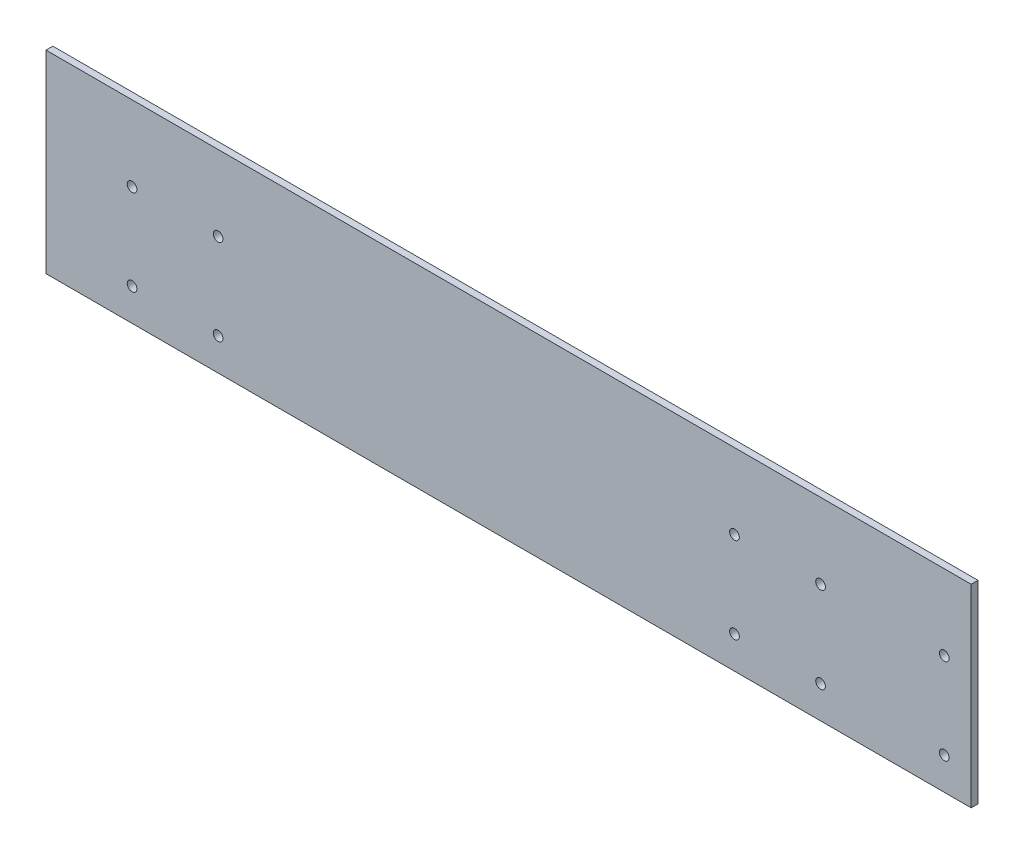
ISO-10303-21;
HEADER;
FILE_DESCRIPTION(('STEP AP214'),'2;1');
FILE_NAME('part.step','',(''),(''),'','','');
FILE_SCHEMA(('AUTOMOTIVE_DESIGN { 1 0 10303 214 1 1 1 1 }'));
ENDSEC;
DATA;
#1=APPLICATION_CONTEXT('core data for automotive mechanical design processes');
#2=APPLICATION_PROTOCOL_DEFINITION('international standard','automotive_design',2000,#1);
#3=PRODUCT_CONTEXT('',#1,'mechanical');
#4=PRODUCT('Part','Part','',(#3));
#5=PRODUCT_RELATED_PRODUCT_CATEGORY('part','',(#4));
#6=PRODUCT_DEFINITION_FORMATION('','',#4);
#7=PRODUCT_DEFINITION_CONTEXT('part definition',#1,'design');
#8=PRODUCT_DEFINITION('design','',#6,#7);
#9=PRODUCT_DEFINITION_SHAPE('','',#8);
#10=(LENGTH_UNIT() NAMED_UNIT(*) SI_UNIT(.MILLI.,.METRE.));
#11=(NAMED_UNIT(*) PLANE_ANGLE_UNIT() SI_UNIT($,.RADIAN.));
#12=(NAMED_UNIT(*) SI_UNIT($,.STERADIAN.) SOLID_ANGLE_UNIT());
#13=UNCERTAINTY_MEASURE_WITH_UNIT(LENGTH_MEASURE(1.E-05),#10,'distance_accuracy_value','');
#14=(GEOMETRIC_REPRESENTATION_CONTEXT(3) GLOBAL_UNCERTAINTY_ASSIGNED_CONTEXT((#13)) GLOBAL_UNIT_ASSIGNED_CONTEXT((#10,
#11,#12)) REPRESENTATION_CONTEXT('',''));
#15=CARTESIAN_POINT('',(0.,0.,0.));
#16=DIRECTION('',(0.,0.,1.));
#17=DIRECTION('',(1.,0.,0.));
#18=AXIS2_PLACEMENT_3D('',#15,#16,#17);
#19=CARTESIAN_POINT('',(0.,0.,0.));
#20=DIRECTION('',(0.,0.,-1.));
#21=DIRECTION('',(-1.,0.,0.));
#22=AXIS2_PLACEMENT_3D('',#19,#20,#21);
#23=PLANE('',#22);
#24=CARTESIAN_POINT('',(-135.,9.99999999999998,0.));
#25=DIRECTION('',(0.,0.,1.));
#26=DIRECTION('',(1.,0.,0.));
#27=AXIS2_PLACEMENT_3D('',#24,#25,#26);
#28=CIRCLE('',#27,2.25);
#29=CARTESIAN_POINT('',(-132.75,9.99999999999998,0.));
#30=VERTEX_POINT('',#29);
#31=EDGE_CURVE('E201',#30,#30,#28,.T.);
#32=ORIENTED_EDGE('',*,*,#31,.T.);
#33=EDGE_LOOP('',(#32));
#34=FACE_BOUND('',#33,.T.);
#35=CARTESIAN_POINT('',(-175.,9.99999999999999,0.));
#36=DIRECTION('',(0.,0.,1.));
#37=DIRECTION('',(1.,0.,0.));
#38=AXIS2_PLACEMENT_3D('',#35,#36,#37);
#39=CIRCLE('',#38,2.25);
#40=CARTESIAN_POINT('',(-172.75,9.99999999999999,0.));
#41=VERTEX_POINT('',#40);
#42=EDGE_CURVE('E185',#41,#41,#39,.T.);
#43=ORIENTED_EDGE('',*,*,#42,.T.);
#44=EDGE_LOOP('',(#43));
#45=FACE_BOUND('',#44,.T.);
#46=CARTESIAN_POINT('',(-135.,-30.,0.));
#47=DIRECTION('',(0.,0.,1.));
#48=DIRECTION('',(1.,0.,0.));
#49=AXIS2_PLACEMENT_3D('',#46,#47,#48);
#50=CIRCLE('',#49,2.25);
#51=CARTESIAN_POINT('',(-132.75,-30.,0.));
#52=VERTEX_POINT('',#51);
#53=EDGE_CURVE('E177',#52,#52,#50,.T.);
#54=ORIENTED_EDGE('',*,*,#53,.T.);
#55=EDGE_LOOP('',(#54));
#56=FACE_BOUND('',#55,.T.);
#57=CARTESIAN_POINT('',(145.,9.99999999999999,0.));
#58=DIRECTION('',(0.,0.,1.));
#59=DIRECTION('',(1.,0.,0.));
#60=AXIS2_PLACEMENT_3D('',#57,#58,#59);
#61=CIRCLE('',#60,2.25);
#62=CARTESIAN_POINT('',(147.25,9.99999999999999,0.));
#63=VERTEX_POINT('',#62);
#64=EDGE_CURVE('E169',#63,#63,#61,.T.);
#65=ORIENTED_EDGE('',*,*,#64,.T.);
#66=EDGE_LOOP('',(#65));
#67=FACE_BOUND('',#66,.T.);
#68=CARTESIAN_POINT('',(105.,-30.,0.));
#69=DIRECTION('',(0.,0.,1.));
#70=DIRECTION('',(1.,0.,0.));
#71=AXIS2_PLACEMENT_3D('',#68,#69,#70);
#72=CIRCLE('',#71,2.25);
#73=CARTESIAN_POINT('',(107.25,-30.,0.));
#74=VERTEX_POINT('',#73);
#75=EDGE_CURVE('E161',#74,#74,#72,.T.);
#76=ORIENTED_EDGE('',*,*,#75,.T.);
#77=EDGE_LOOP('',(#76));
#78=FACE_BOUND('',#77,.T.);
#79=CARTESIAN_POINT('',(105.,9.99999999999999,0.));
#80=DIRECTION('',(0.,0.,1.));
#81=DIRECTION('',(1.,0.,0.));
#82=AXIS2_PLACEMENT_3D('',#79,#80,#81);
#83=CIRCLE('',#82,2.25);
#84=CARTESIAN_POINT('',(107.25,9.99999999999999,0.));
#85=VERTEX_POINT('',#84);
#86=EDGE_CURVE('E153',#85,#85,#83,.T.);
#87=ORIENTED_EDGE('',*,*,#86,.T.);
#88=EDGE_LOOP('',(#87));
#89=FACE_BOUND('',#88,.T.);
#90=CARTESIAN_POINT('',(145.,-30.,0.));
#91=DIRECTION('',(0.,0.,1.));
#92=DIRECTION('',(1.,0.,0.));
#93=AXIS2_PLACEMENT_3D('',#90,#91,#92);
#94=CIRCLE('',#93,2.25);
#95=CARTESIAN_POINT('',(147.25,-30.,0.));
#96=VERTEX_POINT('',#95);
#97=EDGE_CURVE('E145',#96,#96,#94,.T.);
#98=ORIENTED_EDGE('',*,*,#97,.T.);
#99=EDGE_LOOP('',(#98));
#100=FACE_BOUND('',#99,.T.);
#101=CARTESIAN_POINT('',(202.5,9.99999999999999,0.));
#102=DIRECTION('',(0.,0.,1.));
#103=DIRECTION('',(1.,0.,0.));
#104=AXIS2_PLACEMENT_3D('',#101,#102,#103);
#105=CIRCLE('',#104,2.25);
#106=CARTESIAN_POINT('',(204.75,9.99999999999999,0.));
#107=VERTEX_POINT('',#106);
#108=EDGE_CURVE('E137',#107,#107,#105,.T.);
#109=ORIENTED_EDGE('',*,*,#108,.T.);
#110=EDGE_LOOP('',(#109));
#111=FACE_BOUND('',#110,.T.);
#112=CARTESIAN_POINT('',(202.5,-30.,0.));
#113=DIRECTION('',(0.,0.,1.));
#114=DIRECTION('',(1.,0.,0.));
#115=AXIS2_PLACEMENT_3D('',#112,#113,#114);
#116=CIRCLE('',#115,2.25);
#117=CARTESIAN_POINT('',(204.75,-30.,0.));
#118=VERTEX_POINT('',#117);
#119=EDGE_CURVE('E113',#118,#118,#116,.T.);
#120=ORIENTED_EDGE('',*,*,#119,.T.);
#121=EDGE_LOOP('',(#120));
#122=FACE_BOUND('',#121,.T.);
#123=DIRECTION('',(0.,1.,0.));
#124=VECTOR('',#123,1.);
#125=CARTESIAN_POINT('',(215.,-45.,0.));
#126=LINE('',#125,#124);
#127=CARTESIAN_POINT('',(215.,-45.,0.));
#128=VERTEX_POINT('',#127);
#129=CARTESIAN_POINT('',(215.,45.,0.));
#130=VERTEX_POINT('',#129);
#131=EDGE_CURVE('E109',#128,#130,#126,.T.);
#132=ORIENTED_EDGE('',*,*,#131,.F.);
#133=DIRECTION('',(1.,0.,0.));
#134=VECTOR('',#133,1.);
#135=CARTESIAN_POINT('',(-215.,-45.,0.));
#136=LINE('',#135,#134);
#137=CARTESIAN_POINT('',(-215.,-45.,0.));
#138=VERTEX_POINT('',#137);
#139=EDGE_CURVE('E80',#138,#128,#136,.T.);
#140=ORIENTED_EDGE('',*,*,#139,.F.);
#141=DIRECTION('',(0.,-1.,0.));
#142=VECTOR('',#141,1.);
#143=CARTESIAN_POINT('',(-215.,-45.,0.));
#144=LINE('',#143,#142);
#145=CARTESIAN_POINT('',(-215.,45.,0.));
#146=VERTEX_POINT('',#145);
#147=EDGE_CURVE('E74',#146,#138,#144,.T.);
#148=ORIENTED_EDGE('',*,*,#147,.F.);
#149=DIRECTION('',(-1.,0.,0.));
#150=VECTOR('',#149,1.);
#151=CARTESIAN_POINT('',(-215.,45.,0.));
#152=LINE('',#151,#150);
#153=EDGE_CURVE('E98',#130,#146,#152,.T.);
#154=ORIENTED_EDGE('',*,*,#153,.F.);
#155=EDGE_LOOP('',(#132,#140,#148,#154));
#156=FACE_BOUND('',#155,.T.);
#157=CARTESIAN_POINT('',(-175.,-30.,0.));
#158=DIRECTION('',(0.,0.,1.));
#159=DIRECTION('',(1.,0.,0.));
#160=AXIS2_PLACEMENT_3D('',#157,#158,#159);
#161=CIRCLE('',#160,2.25);
#162=CARTESIAN_POINT('',(-172.75,-30.,0.));
#163=VERTEX_POINT('',#162);
#164=EDGE_CURVE('E193',#163,#163,#161,.T.);
#165=ORIENTED_EDGE('',*,*,#164,.T.);
#166=EDGE_LOOP('',(#165));
#167=FACE_BOUND('',#166,.T.);
#168=ADVANCED_FACE('F39',(#34,#45,#56,#67,#78,#89,#100,#111,#122,#156,#167),#23,.T.);
#169=CARTESIAN_POINT('',(0.,0.,3.175));
#170=DIRECTION('',(0.,0.,-1.));
#171=DIRECTION('',(-1.,0.,0.));
#172=AXIS2_PLACEMENT_3D('',#169,#170,#171);
#173=PLANE('',#172);
#174=CARTESIAN_POINT('',(-135.,9.99999999999998,3.175));
#175=DIRECTION('',(0.,0.,1.));
#176=DIRECTION('',(1.,0.,0.));
#177=AXIS2_PLACEMENT_3D('',#174,#175,#176);
#178=CIRCLE('',#177,2.24999999999997);
#179=CARTESIAN_POINT('',(-132.75,9.99999999999998,3.175));
#180=VERTEX_POINT('',#179);
#181=EDGE_CURVE('E205',#180,#180,#178,.T.);
#182=ORIENTED_EDGE('',*,*,#181,.F.);
#183=EDGE_LOOP('',(#182));
#184=FACE_BOUND('',#183,.T.);
#185=CARTESIAN_POINT('',(-175.,-30.,3.175));
#186=DIRECTION('',(0.,0.,1.));
#187=DIRECTION('',(1.,0.,0.));
#188=AXIS2_PLACEMENT_3D('',#185,#186,#187);
#189=CIRCLE('',#188,2.24999999999997);
#190=CARTESIAN_POINT('',(-172.75,-30.,3.175));
#191=VERTEX_POINT('',#190);
#192=EDGE_CURVE('E197',#191,#191,#189,.T.);
#193=ORIENTED_EDGE('',*,*,#192,.F.);
#194=EDGE_LOOP('',(#193));
#195=FACE_BOUND('',#194,.T.);
#196=CARTESIAN_POINT('',(-175.,9.99999999999999,3.175));
#197=DIRECTION('',(0.,0.,1.));
#198=DIRECTION('',(1.,0.,0.));
#199=AXIS2_PLACEMENT_3D('',#196,#197,#198);
#200=CIRCLE('',#199,2.24999999999997);
#201=CARTESIAN_POINT('',(-172.75,9.99999999999999,3.175));
#202=VERTEX_POINT('',#201);
#203=EDGE_CURVE('E189',#202,#202,#200,.T.);
#204=ORIENTED_EDGE('',*,*,#203,.F.);
#205=EDGE_LOOP('',(#204));
#206=FACE_BOUND('',#205,.T.);
#207=CARTESIAN_POINT('',(-135.,-30.,3.175));
#208=DIRECTION('',(0.,0.,1.));
#209=DIRECTION('',(1.,0.,0.));
#210=AXIS2_PLACEMENT_3D('',#207,#208,#209);
#211=CIRCLE('',#210,2.24999999999997);
#212=CARTESIAN_POINT('',(-132.75,-30.,3.175));
#213=VERTEX_POINT('',#212);
#214=EDGE_CURVE('E181',#213,#213,#211,.T.);
#215=ORIENTED_EDGE('',*,*,#214,.F.);
#216=EDGE_LOOP('',(#215));
#217=FACE_BOUND('',#216,.T.);
#218=CARTESIAN_POINT('',(145.,9.99999999999999,3.175));
#219=DIRECTION('',(0.,0.,1.));
#220=DIRECTION('',(1.,0.,0.));
#221=AXIS2_PLACEMENT_3D('',#218,#219,#220);
#222=CIRCLE('',#221,2.25);
#223=CARTESIAN_POINT('',(147.25,9.99999999999999,3.175));
#224=VERTEX_POINT('',#223);
#225=EDGE_CURVE('E173',#224,#224,#222,.T.);
#226=ORIENTED_EDGE('',*,*,#225,.F.);
#227=EDGE_LOOP('',(#226));
#228=FACE_BOUND('',#227,.T.);
#229=CARTESIAN_POINT('',(105.,-30.,3.175));
#230=DIRECTION('',(0.,0.,1.));
#231=DIRECTION('',(1.,0.,0.));
#232=AXIS2_PLACEMENT_3D('',#229,#230,#231);
#233=CIRCLE('',#232,2.24999999999999);
#234=CARTESIAN_POINT('',(107.25,-30.,3.175));
#235=VERTEX_POINT('',#234);
#236=EDGE_CURVE('E165',#235,#235,#233,.T.);
#237=ORIENTED_EDGE('',*,*,#236,.F.);
#238=EDGE_LOOP('',(#237));
#239=FACE_BOUND('',#238,.T.);
#240=CARTESIAN_POINT('',(105.,9.99999999999999,3.175));
#241=DIRECTION('',(0.,0.,1.));
#242=DIRECTION('',(1.,0.,0.));
#243=AXIS2_PLACEMENT_3D('',#240,#241,#242);
#244=CIRCLE('',#243,2.24999999999999);
#245=CARTESIAN_POINT('',(107.25,9.99999999999999,3.175));
#246=VERTEX_POINT('',#245);
#247=EDGE_CURVE('E157',#246,#246,#244,.T.);
#248=ORIENTED_EDGE('',*,*,#247,.F.);
#249=EDGE_LOOP('',(#248));
#250=FACE_BOUND('',#249,.T.);
#251=CARTESIAN_POINT('',(145.,-30.,3.175));
#252=DIRECTION('',(0.,0.,1.));
#253=DIRECTION('',(1.,0.,0.));
#254=AXIS2_PLACEMENT_3D('',#251,#252,#253);
#255=CIRCLE('',#254,2.25);
#256=CARTESIAN_POINT('',(147.25,-30.,3.175));
#257=VERTEX_POINT('',#256);
#258=EDGE_CURVE('E149',#257,#257,#255,.T.);
#259=ORIENTED_EDGE('',*,*,#258,.F.);
#260=EDGE_LOOP('',(#259));
#261=FACE_BOUND('',#260,.T.);
#262=CARTESIAN_POINT('',(202.5,-30.,3.175));
#263=DIRECTION('',(0.,0.,1.));
#264=DIRECTION('',(1.,0.,0.));
#265=AXIS2_PLACEMENT_3D('',#262,#263,#264);
#266=CIRCLE('',#265,2.25);
#267=CARTESIAN_POINT('',(204.75,-30.,3.175));
#268=VERTEX_POINT('',#267);
#269=EDGE_CURVE('E133',#268,#268,#266,.T.);
#270=ORIENTED_EDGE('',*,*,#269,.F.);
#271=EDGE_LOOP('',(#270));
#272=FACE_BOUND('',#271,.T.);
#273=DIRECTION('',(0.,1.,0.));
#274=VECTOR('',#273,1.);
#275=CARTESIAN_POINT('',(215.,-45.,3.175));
#276=LINE('',#275,#274);
#277=CARTESIAN_POINT('',(215.,-45.,3.175));
#278=VERTEX_POINT('',#277);
#279=CARTESIAN_POINT('',(215.,45.,3.175));
#280=VERTEX_POINT('',#279);
#281=EDGE_CURVE('E93',#278,#280,#276,.T.);
#282=ORIENTED_EDGE('',*,*,#281,.T.);
#283=DIRECTION('',(-1.,0.,0.));
#284=VECTOR('',#283,1.);
#285=CARTESIAN_POINT('',(-215.,45.,3.175));
#286=LINE('',#285,#284);
#287=CARTESIAN_POINT('',(-215.,45.,3.175));
#288=VERTEX_POINT('',#287);
#289=EDGE_CURVE('E87',#280,#288,#286,.T.);
#290=ORIENTED_EDGE('',*,*,#289,.T.);
#291=DIRECTION('',(0.,-1.,0.));
#292=VECTOR('',#291,1.);
#293=CARTESIAN_POINT('',(-215.,-45.,3.175));
#294=LINE('',#293,#292);
#295=CARTESIAN_POINT('',(-215.,-45.,3.175));
#296=VERTEX_POINT('',#295);
#297=EDGE_CURVE('E91',#288,#296,#294,.T.);
#298=ORIENTED_EDGE('',*,*,#297,.T.);
#299=DIRECTION('',(1.,0.,0.));
#300=VECTOR('',#299,1.);
#301=CARTESIAN_POINT('',(-215.,-45.,3.175));
#302=LINE('',#301,#300);
#303=EDGE_CURVE('E57',#296,#278,#302,.T.);
#304=ORIENTED_EDGE('',*,*,#303,.T.);
#305=EDGE_LOOP('',(#282,#290,#298,#304));
#306=FACE_BOUND('',#305,.T.);
#307=CARTESIAN_POINT('',(202.5,9.99999999999999,3.175));
#308=DIRECTION('',(0.,0.,1.));
#309=DIRECTION('',(1.,0.,0.));
#310=AXIS2_PLACEMENT_3D('',#307,#308,#309);
#311=CIRCLE('',#310,2.25);
#312=CARTESIAN_POINT('',(204.75,9.99999999999999,3.175));
#313=VERTEX_POINT('',#312);
#314=EDGE_CURVE('E141',#313,#313,#311,.T.);
#315=ORIENTED_EDGE('',*,*,#314,.F.);
#316=EDGE_LOOP('',(#315));
#317=FACE_BOUND('',#316,.T.);
#318=ADVANCED_FACE('F88',(#184,#195,#206,#217,#228,#239,#250,#261,#272,#306,#317),#173,.F.);
#319=CARTESIAN_POINT('',(215.,-45.,3.175));
#320=DIRECTION('',(-1.,0.,0.));
#321=DIRECTION('',(0.,0.,1.));
#322=AXIS2_PLACEMENT_3D('',#319,#320,#321);
#323=PLANE('',#322);
#324=ORIENTED_EDGE('',*,*,#131,.T.);
#325=DIRECTION('',(0.,0.,-1.));
#326=VECTOR('',#325,1.);
#327=CARTESIAN_POINT('',(215.,45.,3.175));
#328=LINE('',#327,#326);
#329=EDGE_CURVE('E11',#280,#130,#328,.T.);
#330=ORIENTED_EDGE('',*,*,#329,.F.);
#331=ORIENTED_EDGE('',*,*,#281,.F.);
#332=DIRECTION('',(0.,0.,-1.));
#333=VECTOR('',#332,1.);
#334=CARTESIAN_POINT('',(215.,-45.,3.175));
#335=LINE('',#334,#333);
#336=EDGE_CURVE('E105',#278,#128,#335,.T.);
#337=ORIENTED_EDGE('',*,*,#336,.T.);
#338=EDGE_LOOP('',(#324,#330,#331,#337));
#339=FACE_BOUND('',#338,.T.);
#340=ADVANCED_FACE('F41',(#339),#323,.F.);
#341=CARTESIAN_POINT('',(-215.,45.,3.175));
#342=DIRECTION('',(0.,-1.,0.));
#343=DIRECTION('',(0.,0.,-1.));
#344=AXIS2_PLACEMENT_3D('',#341,#342,#343);
#345=PLANE('',#344);
#346=ORIENTED_EDGE('',*,*,#153,.T.);
#347=DIRECTION('',(0.,0.,-1.));
#348=VECTOR('',#347,1.);
#349=CARTESIAN_POINT('',(-215.,45.,3.175));
#350=LINE('',#349,#348);
#351=EDGE_CURVE('E49',#288,#146,#350,.T.);
#352=ORIENTED_EDGE('',*,*,#351,.F.);
#353=ORIENTED_EDGE('',*,*,#289,.F.);
#354=ORIENTED_EDGE('',*,*,#329,.T.);
#355=EDGE_LOOP('',(#346,#352,#353,#354));
#356=FACE_BOUND('',#355,.T.);
#357=ADVANCED_FACE('F97',(#356),#345,.F.);
#358=CARTESIAN_POINT('',(-215.,-45.,3.175));
#359=DIRECTION('',(1.,0.,0.));
#360=DIRECTION('',(0.,0.,-1.));
#361=AXIS2_PLACEMENT_3D('',#358,#359,#360);
#362=PLANE('',#361);
#363=ORIENTED_EDGE('',*,*,#147,.T.);
#364=DIRECTION('',(0.,0.,-1.));
#365=VECTOR('',#364,1.);
#366=CARTESIAN_POINT('',(-215.,-45.,3.175));
#367=LINE('',#366,#365);
#368=EDGE_CURVE('E100',#296,#138,#367,.T.);
#369=ORIENTED_EDGE('',*,*,#368,.F.);
#370=ORIENTED_EDGE('',*,*,#297,.F.);
#371=ORIENTED_EDGE('',*,*,#351,.T.);
#372=EDGE_LOOP('',(#363,#369,#370,#371));
#373=FACE_BOUND('',#372,.T.);
#374=ADVANCED_FACE('F101',(#373),#362,.F.);
#375=CARTESIAN_POINT('',(-215.,-45.,3.175));
#376=DIRECTION('',(0.,1.,0.));
#377=DIRECTION('',(0.,0.,1.));
#378=AXIS2_PLACEMENT_3D('',#375,#376,#377);
#379=PLANE('',#378);
#380=ORIENTED_EDGE('',*,*,#139,.T.);
#381=ORIENTED_EDGE('',*,*,#336,.F.);
#382=ORIENTED_EDGE('',*,*,#303,.F.);
#383=ORIENTED_EDGE('',*,*,#368,.T.);
#384=EDGE_LOOP('',(#380,#381,#382,#383));
#385=FACE_BOUND('',#384,.T.);
#386=ADVANCED_FACE('F123',(#385),#379,.F.);
#387=CARTESIAN_POINT('',(202.5,-30.,3.175));
#388=DIRECTION('',(0.,0.,1.));
#389=DIRECTION('',(1.,0.,0.));
#390=AXIS2_PLACEMENT_3D('',#387,#388,#389);
#391=CYLINDRICAL_SURFACE('',#390,2.25);
#392=ORIENTED_EDGE('',*,*,#119,.F.);
#393=EDGE_LOOP('',(#392));
#394=FACE_BOUND('',#393,.T.);
#395=ORIENTED_EDGE('',*,*,#269,.T.);
#396=EDGE_LOOP('',(#395));
#397=FACE_BOUND('',#396,.T.);
#398=ADVANCED_FACE('F231',(#394,#397),#391,.F.);
#399=CARTESIAN_POINT('',(202.5,9.99999999999999,3.175));
#400=DIRECTION('',(0.,0.,1.));
#401=DIRECTION('',(1.,0.,0.));
#402=AXIS2_PLACEMENT_3D('',#399,#400,#401);
#403=CYLINDRICAL_SURFACE('',#402,2.25);
#404=ORIENTED_EDGE('',*,*,#108,.F.);
#405=EDGE_LOOP('',(#404));
#406=FACE_BOUND('',#405,.T.);
#407=ORIENTED_EDGE('',*,*,#314,.T.);
#408=EDGE_LOOP('',(#407));
#409=FACE_BOUND('',#408,.T.);
#410=ADVANCED_FACE('F233',(#406,#409),#403,.F.);
#411=CARTESIAN_POINT('',(145.,-30.,3.175));
#412=DIRECTION('',(0.,0.,1.));
#413=DIRECTION('',(1.,0.,0.));
#414=AXIS2_PLACEMENT_3D('',#411,#412,#413);
#415=CYLINDRICAL_SURFACE('',#414,2.25);
#416=ORIENTED_EDGE('',*,*,#97,.F.);
#417=EDGE_LOOP('',(#416));
#418=FACE_BOUND('',#417,.T.);
#419=ORIENTED_EDGE('',*,*,#258,.T.);
#420=EDGE_LOOP('',(#419));
#421=FACE_BOUND('',#420,.T.);
#422=ADVANCED_FACE('F240',(#418,#421),#415,.F.);
#423=CARTESIAN_POINT('',(105.,9.99999999999999,3.175));
#424=DIRECTION('',(0.,0.,1.));
#425=DIRECTION('',(1.,0.,0.));
#426=AXIS2_PLACEMENT_3D('',#423,#424,#425);
#427=CYLINDRICAL_SURFACE('',#426,2.25);
#428=ORIENTED_EDGE('',*,*,#86,.F.);
#429=EDGE_LOOP('',(#428));
#430=FACE_BOUND('',#429,.T.);
#431=ORIENTED_EDGE('',*,*,#247,.T.);
#432=EDGE_LOOP('',(#431));
#433=FACE_BOUND('',#432,.T.);
#434=ADVANCED_FACE('F286',(#430,#433),#427,.F.);
#435=CARTESIAN_POINT('',(105.,-30.,3.175));
#436=DIRECTION('',(0.,0.,1.));
#437=DIRECTION('',(1.,0.,0.));
#438=AXIS2_PLACEMENT_3D('',#435,#436,#437);
#439=CYLINDRICAL_SURFACE('',#438,2.25);
#440=ORIENTED_EDGE('',*,*,#75,.F.);
#441=EDGE_LOOP('',(#440));
#442=FACE_BOUND('',#441,.T.);
#443=ORIENTED_EDGE('',*,*,#236,.T.);
#444=EDGE_LOOP('',(#443));
#445=FACE_BOUND('',#444,.T.);
#446=ADVANCED_FACE('F296',(#442,#445),#439,.F.);
#447=CARTESIAN_POINT('',(145.,9.99999999999999,3.175));
#448=DIRECTION('',(0.,0.,1.));
#449=DIRECTION('',(1.,0.,0.));
#450=AXIS2_PLACEMENT_3D('',#447,#448,#449);
#451=CYLINDRICAL_SURFACE('',#450,2.25);
#452=ORIENTED_EDGE('',*,*,#64,.F.);
#453=EDGE_LOOP('',(#452));
#454=FACE_BOUND('',#453,.T.);
#455=ORIENTED_EDGE('',*,*,#225,.T.);
#456=EDGE_LOOP('',(#455));
#457=FACE_BOUND('',#456,.T.);
#458=ADVANCED_FACE('F306',(#454,#457),#451,.F.);
#459=CARTESIAN_POINT('',(-135.,-30.,3.175));
#460=DIRECTION('',(0.,0.,1.));
#461=DIRECTION('',(1.,0.,0.));
#462=AXIS2_PLACEMENT_3D('',#459,#460,#461);
#463=CYLINDRICAL_SURFACE('',#462,2.24999999999999);
#464=ORIENTED_EDGE('',*,*,#53,.F.);
#465=EDGE_LOOP('',(#464));
#466=FACE_BOUND('',#465,.T.);
#467=ORIENTED_EDGE('',*,*,#214,.T.);
#468=EDGE_LOOP('',(#467));
#469=FACE_BOUND('',#468,.T.);
#470=ADVANCED_FACE('F316',(#466,#469),#463,.F.);
#471=CARTESIAN_POINT('',(-175.,9.99999999999999,3.175));
#472=DIRECTION('',(0.,0.,1.));
#473=DIRECTION('',(1.,0.,0.));
#474=AXIS2_PLACEMENT_3D('',#471,#472,#473);
#475=CYLINDRICAL_SURFACE('',#474,2.24999999999999);
#476=ORIENTED_EDGE('',*,*,#42,.F.);
#477=EDGE_LOOP('',(#476));
#478=FACE_BOUND('',#477,.T.);
#479=ORIENTED_EDGE('',*,*,#203,.T.);
#480=EDGE_LOOP('',(#479));
#481=FACE_BOUND('',#480,.T.);
#482=ADVANCED_FACE('F326',(#478,#481),#475,.F.);
#483=CARTESIAN_POINT('',(-175.,-30.,3.175));
#484=DIRECTION('',(0.,0.,1.));
#485=DIRECTION('',(1.,0.,0.));
#486=AXIS2_PLACEMENT_3D('',#483,#484,#485);
#487=CYLINDRICAL_SURFACE('',#486,2.24999999999999);
#488=ORIENTED_EDGE('',*,*,#164,.F.);
#489=EDGE_LOOP('',(#488));
#490=FACE_BOUND('',#489,.T.);
#491=ORIENTED_EDGE('',*,*,#192,.T.);
#492=EDGE_LOOP('',(#491));
#493=FACE_BOUND('',#492,.T.);
#494=ADVANCED_FACE('F336',(#490,#493),#487,.F.);
#495=CARTESIAN_POINT('',(-135.,9.99999999999998,3.175));
#496=DIRECTION('',(0.,0.,1.));
#497=DIRECTION('',(1.,0.,0.));
#498=AXIS2_PLACEMENT_3D('',#495,#496,#497);
#499=CYLINDRICAL_SURFACE('',#498,2.24999999999999);
#500=ORIENTED_EDGE('',*,*,#31,.F.);
#501=EDGE_LOOP('',(#500));
#502=FACE_BOUND('',#501,.T.);
#503=ORIENTED_EDGE('',*,*,#181,.T.);
#504=EDGE_LOOP('',(#503));
#505=FACE_BOUND('',#504,.T.);
#506=ADVANCED_FACE('F210',(#502,#505),#499,.F.);
#507=CLOSED_SHELL('',(#168,#318,#340,#357,#374,#386,#398,#410,#422,#434,#446,#458,#470,#482,
#494,#506));
#508=MANIFOLD_SOLID_BREP('B2',#507);
#509=ADVANCED_BREP_SHAPE_REPRESENTATION('',(#18,#508),#14);
#510=SHAPE_DEFINITION_REPRESENTATION(#9,#509);
ENDSEC;
END-ISO-10303-21;
